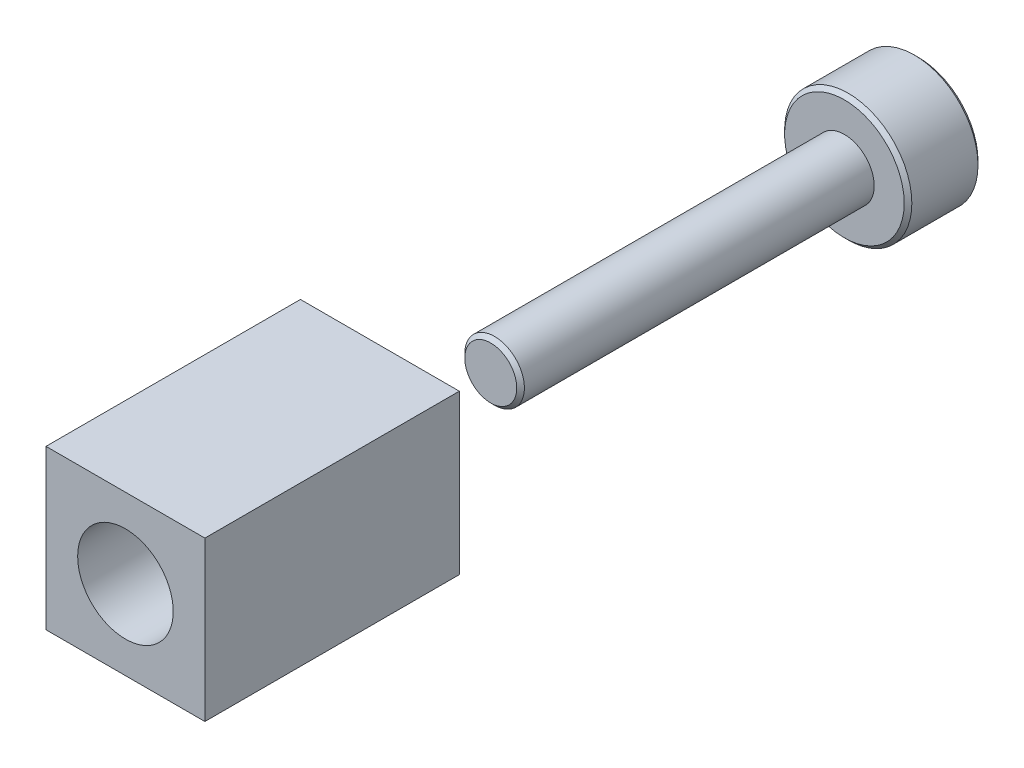
ISO-10303-21;
HEADER;
FILE_DESCRIPTION(('STEP AP214'),'2;1');
FILE_NAME('part.step','',(''),(''),'','','');
FILE_SCHEMA(('AUTOMOTIVE_DESIGN { 1 0 10303 214 1 1 1 1 }'));
ENDSEC;
DATA;
#1=APPLICATION_CONTEXT('core data for automotive mechanical design processes');
#2=APPLICATION_PROTOCOL_DEFINITION('international standard','automotive_design',2000,#1);
#3=PRODUCT_CONTEXT('',#1,'mechanical');
#4=PRODUCT('Part','Part','',(#3));
#5=PRODUCT_RELATED_PRODUCT_CATEGORY('part','',(#4));
#6=PRODUCT_DEFINITION_FORMATION('','',#4);
#7=PRODUCT_DEFINITION_CONTEXT('part definition',#1,'design');
#8=PRODUCT_DEFINITION('design','',#6,#7);
#9=PRODUCT_DEFINITION_SHAPE('','',#8);
#10=(LENGTH_UNIT() NAMED_UNIT(*) SI_UNIT(.MILLI.,.METRE.));
#11=(NAMED_UNIT(*) PLANE_ANGLE_UNIT() SI_UNIT($,.RADIAN.));
#12=(NAMED_UNIT(*) SI_UNIT($,.STERADIAN.) SOLID_ANGLE_UNIT());
#13=UNCERTAINTY_MEASURE_WITH_UNIT(LENGTH_MEASURE(1.E-05),#10,'distance_accuracy_value','');
#14=(GEOMETRIC_REPRESENTATION_CONTEXT(3) GLOBAL_UNCERTAINTY_ASSIGNED_CONTEXT((#13)) GLOBAL_UNIT_ASSIGNED_CONTEXT((#10,
#11,#12)) REPRESENTATION_CONTEXT('',''));
#15=CARTESIAN_POINT('',(0.,0.,0.));
#16=DIRECTION('',(0.,0.,1.));
#17=DIRECTION('',(1.,0.,0.));
#18=AXIS2_PLACEMENT_3D('',#15,#16,#17);
#19=CARTESIAN_POINT('',(-15.8613491960392,15.8613491960392,158.283276511442));
#20=DIRECTION('',(1.,0.,0.));
#21=DIRECTION('',(0.,1.,0.));
#22=AXIS2_PLACEMENT_3D('',#19,#20,#21);
#23=PLANE('',#22);
#24=DIRECTION('',(0.,-1.,0.));
#25=VECTOR('',#24,1.);
#26=CARTESIAN_POINT('',(-15.8613491960392,15.8613491960392,107.483276511442));
#27=LINE('',#26,#25);
#28=CARTESIAN_POINT('',(-15.8613491960392,15.8613491960392,107.483276511442));
#29=VERTEX_POINT('',#28);
#30=CARTESIAN_POINT('',(-15.8613491960392,-15.8613491960392,107.483276511442));
#31=VERTEX_POINT('',#30);
#32=EDGE_CURVE('E107',#29,#31,#27,.T.);
#33=ORIENTED_EDGE('',*,*,#32,.T.);
#34=DIRECTION('',(0.,0.,-1.));
#35=VECTOR('',#34,1.);
#36=CARTESIAN_POINT('',(-15.8613491960392,-15.8613491960392,158.283276511442));
#37=LINE('',#36,#35);
#38=CARTESIAN_POINT('',(-15.8613491960392,-15.8613491960392,158.283276511442));
#39=VERTEX_POINT('',#38);
#40=EDGE_CURVE('E12',#39,#31,#37,.T.);
#41=ORIENTED_EDGE('',*,*,#40,.F.);
#42=DIRECTION('',(0.,-1.,0.));
#43=VECTOR('',#42,1.);
#44=CARTESIAN_POINT('',(-15.8613491960392,15.8613491960392,158.283276511442));
#45=LINE('',#44,#43);
#46=CARTESIAN_POINT('',(-15.8613491960392,15.8613491960392,158.283276511442));
#47=VERTEX_POINT('',#46);
#48=EDGE_CURVE('E95',#47,#39,#45,.T.);
#49=ORIENTED_EDGE('',*,*,#48,.F.);
#50=DIRECTION('',(0.,0.,-1.));
#51=VECTOR('',#50,1.);
#52=CARTESIAN_POINT('',(-15.8613491960392,15.8613491960392,158.283276511442));
#53=LINE('',#52,#51);
#54=EDGE_CURVE('E103',#47,#29,#53,.T.);
#55=ORIENTED_EDGE('',*,*,#54,.T.);
#56=EDGE_LOOP('',(#33,#41,#49,#55));
#57=FACE_BOUND('',#56,.T.);
#58=ADVANCED_FACE('F44',(#57),#23,.F.);
#59=CARTESIAN_POINT('',(-15.8613491960392,-15.8613491960392,158.283276511442));
#60=DIRECTION('',(0.,1.,0.));
#61=DIRECTION('',(0.,0.,1.));
#62=AXIS2_PLACEMENT_3D('',#59,#60,#61);
#63=PLANE('',#62);
#64=DIRECTION('',(1.,0.,0.));
#65=VECTOR('',#64,1.);
#66=CARTESIAN_POINT('',(-15.8613491960392,-15.8613491960392,107.483276511442));
#67=LINE('',#66,#65);
#68=CARTESIAN_POINT('',(15.8613491960392,-15.8613491960392,107.483276511442));
#69=VERTEX_POINT('',#68);
#70=EDGE_CURVE('E99',#31,#69,#67,.T.);
#71=ORIENTED_EDGE('',*,*,#70,.T.);
#72=DIRECTION('',(0.,0.,-1.));
#73=VECTOR('',#72,1.);
#74=CARTESIAN_POINT('',(15.8613491960392,-15.8613491960392,158.283276511442));
#75=LINE('',#74,#73);
#76=CARTESIAN_POINT('',(15.8613491960392,-15.8613491960392,158.283276511442));
#77=VERTEX_POINT('',#76);
#78=EDGE_CURVE('E52',#77,#69,#75,.T.);
#79=ORIENTED_EDGE('',*,*,#78,.F.);
#80=DIRECTION('',(1.,0.,0.));
#81=VECTOR('',#80,1.);
#82=CARTESIAN_POINT('',(-15.8613491960392,-15.8613491960392,158.283276511442));
#83=LINE('',#82,#81);
#84=EDGE_CURVE('E90',#39,#77,#83,.T.);
#85=ORIENTED_EDGE('',*,*,#84,.F.);
#86=ORIENTED_EDGE('',*,*,#40,.T.);
#87=EDGE_LOOP('',(#71,#79,#85,#86));
#88=FACE_BOUND('',#87,.T.);
#89=ADVANCED_FACE('F98',(#88),#63,.F.);
#90=CARTESIAN_POINT('',(15.8613491960392,15.8613491960392,158.283276511442));
#91=DIRECTION('',(-1.,0.,0.));
#92=DIRECTION('',(0.,-1.,0.));
#93=AXIS2_PLACEMENT_3D('',#90,#91,#92);
#94=PLANE('',#93);
#95=DIRECTION('',(0.,1.,0.));
#96=VECTOR('',#95,1.);
#97=CARTESIAN_POINT('',(15.8613491960392,15.8613491960392,107.483276511442));
#98=LINE('',#97,#96);
#99=CARTESIAN_POINT('',(15.8613491960392,15.8613491960392,107.483276511442));
#100=VERTEX_POINT('',#99);
#101=EDGE_CURVE('E77',#69,#100,#98,.T.);
#102=ORIENTED_EDGE('',*,*,#101,.T.);
#103=DIRECTION('',(0.,0.,-1.));
#104=VECTOR('',#103,1.);
#105=CARTESIAN_POINT('',(15.8613491960392,15.8613491960392,158.283276511442));
#106=LINE('',#105,#104);
#107=CARTESIAN_POINT('',(15.8613491960392,15.8613491960392,158.283276511442));
#108=VERTEX_POINT('',#107);
#109=EDGE_CURVE('E100',#108,#100,#106,.T.);
#110=ORIENTED_EDGE('',*,*,#109,.F.);
#111=DIRECTION('',(0.,1.,0.));
#112=VECTOR('',#111,1.);
#113=CARTESIAN_POINT('',(15.8613491960392,15.8613491960392,158.283276511442));
#114=LINE('',#113,#112);
#115=EDGE_CURVE('E93',#77,#108,#114,.T.);
#116=ORIENTED_EDGE('',*,*,#115,.F.);
#117=ORIENTED_EDGE('',*,*,#78,.T.);
#118=EDGE_LOOP('',(#102,#110,#116,#117));
#119=FACE_BOUND('',#118,.T.);
#120=ADVANCED_FACE('F101',(#119),#94,.F.);
#121=CARTESIAN_POINT('',(-15.8613491960392,15.8613491960392,158.283276511442));
#122=DIRECTION('',(0.,-1.,0.));
#123=DIRECTION('',(0.,0.,-1.));
#124=AXIS2_PLACEMENT_3D('',#121,#122,#123);
#125=PLANE('',#124);
#126=DIRECTION('',(-1.,0.,0.));
#127=VECTOR('',#126,1.);
#128=CARTESIAN_POINT('',(-15.8613491960392,15.8613491960392,107.483276511442));
#129=LINE('',#128,#127);
#130=EDGE_CURVE('E83',#100,#29,#129,.T.);
#131=ORIENTED_EDGE('',*,*,#130,.T.);
#132=ORIENTED_EDGE('',*,*,#54,.F.);
#133=DIRECTION('',(-1.,0.,0.));
#134=VECTOR('',#133,1.);
#135=CARTESIAN_POINT('',(-15.8613491960392,15.8613491960392,158.283276511442));
#136=LINE('',#135,#134);
#137=EDGE_CURVE('E60',#108,#47,#136,.T.);
#138=ORIENTED_EDGE('',*,*,#137,.F.);
#139=ORIENTED_EDGE('',*,*,#109,.T.);
#140=EDGE_LOOP('',(#131,#132,#138,#139));
#141=FACE_BOUND('',#140,.T.);
#142=ADVANCED_FACE('F115',(#141),#125,.F.);
#143=CARTESIAN_POINT('',(0.,0.,158.283276511442));
#144=DIRECTION('',(0.,0.,1.));
#145=DIRECTION('',(1.,0.,0.));
#146=AXIS2_PLACEMENT_3D('',#143,#144,#145);
#147=PLANE('',#146);
#148=CARTESIAN_POINT('',(0.,0.,158.283276511442));
#149=DIRECTION('',(0.,0.,-1.));
#150=DIRECTION('',(-1.,0.,0.));
#151=AXIS2_PLACEMENT_3D('',#148,#149,#150);
#152=CIRCLE('',#151,9.54173223558893);
#153=CARTESIAN_POINT('',(-9.54173223558893,0.,158.283276511442));
#154=VERTEX_POINT('',#153);
#155=EDGE_CURVE('E110',#154,#154,#152,.T.);
#156=ORIENTED_EDGE('',*,*,#155,.T.);
#157=EDGE_LOOP('',(#156));
#158=FACE_BOUND('',#157,.T.);
#159=ORIENTED_EDGE('',*,*,#48,.T.);
#160=ORIENTED_EDGE('',*,*,#84,.T.);
#161=ORIENTED_EDGE('',*,*,#115,.T.);
#162=ORIENTED_EDGE('',*,*,#137,.T.);
#163=EDGE_LOOP('',(#159,#160,#161,#162));
#164=FACE_BOUND('',#163,.T.);
#165=ADVANCED_FACE('F91',(#158,#164),#147,.T.);
#166=CARTESIAN_POINT('',(0.,0.,107.483276511442));
#167=DIRECTION('',(0.,0.,1.));
#168=DIRECTION('',(1.,0.,0.));
#169=AXIS2_PLACEMENT_3D('',#166,#167,#168);
#170=PLANE('',#169);
#171=CARTESIAN_POINT('',(0.,0.,107.483276511442));
#172=DIRECTION('',(0.,0.,-1.));
#173=DIRECTION('',(-1.,0.,0.));
#174=AXIS2_PLACEMENT_3D('',#171,#172,#173);
#175=CIRCLE('',#174,9.54173223558893);
#176=CARTESIAN_POINT('',(-9.54173223558893,0.,107.483276511442));
#177=VERTEX_POINT('',#176);
#178=EDGE_CURVE('E121',#177,#177,#175,.T.);
#179=ORIENTED_EDGE('',*,*,#178,.F.);
#180=EDGE_LOOP('',(#179));
#181=FACE_BOUND('',#180,.T.);
#182=ORIENTED_EDGE('',*,*,#32,.F.);
#183=ORIENTED_EDGE('',*,*,#130,.F.);
#184=ORIENTED_EDGE('',*,*,#101,.F.);
#185=ORIENTED_EDGE('',*,*,#70,.F.);
#186=EDGE_LOOP('',(#182,#183,#184,#185));
#187=FACE_BOUND('',#186,.T.);
#188=ADVANCED_FACE('F118',(#181,#187),#170,.F.);
#189=CARTESIAN_POINT('',(0.,0.,158.283276511442));
#190=DIRECTION('',(0.,0.,-1.));
#191=DIRECTION('',(-1.,0.,0.));
#192=AXIS2_PLACEMENT_3D('',#189,#190,#191);
#193=CYLINDRICAL_SURFACE('',#192,9.54173223558893);
#194=ORIENTED_EDGE('',*,*,#155,.F.);
#195=EDGE_LOOP('',(#194));
#196=FACE_BOUND('',#195,.T.);
#197=ORIENTED_EDGE('',*,*,#178,.T.);
#198=EDGE_LOOP('',(#197));
#199=FACE_BOUND('',#198,.T.);
#200=ADVANCED_FACE('F128',(#196,#199),#193,.F.);
#201=CLOSED_SHELL('',(#58,#89,#120,#142,#165,#188,#200));
#202=MANIFOLD_SOLID_BREP('B2',#201);
#203=CARTESIAN_POINT('',(0.,0.,14.732));
#204=DIRECTION('',(0.,0.,1.));
#205=DIRECTION('',(1.,0.,0.));
#206=AXIS2_PLACEMENT_3D('',#203,#204,#205);
#207=PLANE('',#206);
#208=CARTESIAN_POINT('',(0.,0.,14.732));
#209=DIRECTION('',(0.,0.,1.));
#210=DIRECTION('',(1.,0.,0.));
#211=AXIS2_PLACEMENT_3D('',#208,#209,#210);
#212=CIRCLE('',#211,11.938);
#213=CARTESIAN_POINT('',(11.938,0.,14.732));
#214=VERTEX_POINT('',#213);
#215=EDGE_CURVE('E199',#214,#214,#212,.T.);
#216=ORIENTED_EDGE('',*,*,#215,.T.);
#217=EDGE_LOOP('',(#216));
#218=FACE_BOUND('',#217,.T.);
#219=CARTESIAN_POINT('',(0.,0.,14.732));
#220=DIRECTION('',(0.,0.,1.));
#221=DIRECTION('',(1.,0.,0.));
#222=AXIS2_PLACEMENT_3D('',#219,#220,#221);
#223=CIRCLE('',#222,5.95369618770292);
#224=CARTESIAN_POINT('',(5.95369618770292,0.,14.732));
#225=VERTEX_POINT('',#224);
#226=EDGE_CURVE('E214',#225,#225,#223,.T.);
#227=ORIENTED_EDGE('',*,*,#226,.F.);
#228=EDGE_LOOP('',(#227));
#229=FACE_BOUND('',#228,.T.);
#230=ADVANCED_FACE('F188',(#218,#229),#207,.T.);
#231=CARTESIAN_POINT('',(0.,0.,14.732));
#232=DIRECTION('',(0.,0.,-1.));
#233=DIRECTION('',(-1.,0.,0.));
#234=AXIS2_PLACEMENT_3D('',#231,#232,#233);
#235=CYLINDRICAL_SURFACE('',#234,12.7);
#236=CARTESIAN_POINT('',(0.,0.,0.762000000000006));
#237=DIRECTION('',(0.,0.,1.));
#238=DIRECTION('',(1.,0.,0.));
#239=AXIS2_PLACEMENT_3D('',#236,#237,#238);
#240=CIRCLE('',#239,12.7);
#241=CARTESIAN_POINT('',(12.7,0.,0.762000000000006));
#242=VERTEX_POINT('',#241);
#243=EDGE_CURVE('E208',#242,#242,#240,.T.);
#244=ORIENTED_EDGE('',*,*,#243,.T.);
#245=EDGE_LOOP('',(#244));
#246=FACE_BOUND('',#245,.T.);
#247=CARTESIAN_POINT('',(0.,0.,13.97));
#248=DIRECTION('',(0.,0.,1.));
#249=DIRECTION('',(1.,0.,0.));
#250=AXIS2_PLACEMENT_3D('',#247,#248,#249);
#251=CIRCLE('',#250,12.7);
#252=CARTESIAN_POINT('',(12.7,0.,13.97));
#253=VERTEX_POINT('',#252);
#254=EDGE_CURVE('E211',#253,#253,#251,.F.);
#255=ORIENTED_EDGE('',*,*,#254,.T.);
#256=EDGE_LOOP('',(#255));
#257=FACE_BOUND('',#256,.T.);
#258=ADVANCED_FACE('F221',(#246,#257),#235,.T.);
#259=CARTESIAN_POINT('',(0.,0.,0.));
#260=DIRECTION('',(0.,0.,1.));
#261=DIRECTION('',(1.,0.,0.));
#262=AXIS2_PLACEMENT_3D('',#259,#260,#261);
#263=PLANE('',#262);
#264=CARTESIAN_POINT('',(0.,0.,0.));
#265=DIRECTION('',(0.,0.,1.));
#266=DIRECTION('',(1.,0.,0.));
#267=AXIS2_PLACEMENT_3D('',#264,#265,#266);
#268=CIRCLE('',#267,11.938);
#269=CARTESIAN_POINT('',(11.938,0.,0.));
#270=VERTEX_POINT('',#269);
#271=EDGE_CURVE('E203',#270,#270,#268,.F.);
#272=ORIENTED_EDGE('',*,*,#271,.T.);
#273=EDGE_LOOP('',(#272));
#274=FACE_BOUND('',#273,.T.);
#275=ADVANCED_FACE('F227',(#274),#263,.F.);
#276=CARTESIAN_POINT('',(0.,0.,85.344));
#277=DIRECTION('',(0.,0.,-1.));
#278=DIRECTION('',(-1.,0.,0.));
#279=AXIS2_PLACEMENT_3D('',#276,#277,#278);
#280=CYLINDRICAL_SURFACE('',#279,5.95369618770292);
#281=CARTESIAN_POINT('',(0.,0.,84.582));
#282=DIRECTION('',(0.,0.,1.));
#283=DIRECTION('',(1.,0.,0.));
#284=AXIS2_PLACEMENT_3D('',#281,#282,#283);
#285=CIRCLE('',#284,5.95369618770292);
#286=CARTESIAN_POINT('',(-5.95369618770292,0.,84.582));
#287=VERTEX_POINT('',#286);
#288=EDGE_CURVE('E43',#287,#287,#285,.F.);
#289=ORIENTED_EDGE('',*,*,#288,.T.);
#290=EDGE_LOOP('',(#289));
#291=FACE_BOUND('',#290,.T.);
#292=ORIENTED_EDGE('',*,*,#226,.T.);
#293=EDGE_LOOP('',(#292));
#294=FACE_BOUND('',#293,.T.);
#295=ADVANCED_FACE('F218',(#291,#294),#280,.T.);
#296=CARTESIAN_POINT('',(0.,0.,85.344));
#297=DIRECTION('',(0.,0.,1.));
#298=DIRECTION('',(1.,0.,0.));
#299=AXIS2_PLACEMENT_3D('',#296,#297,#298);
#300=PLANE('',#299);
#301=CARTESIAN_POINT('',(0.,0.,85.344));
#302=DIRECTION('',(0.,0.,1.));
#303=DIRECTION('',(1.,0.,0.));
#304=AXIS2_PLACEMENT_3D('',#301,#302,#303);
#305=CIRCLE('',#304,5.1916961877029);
#306=CARTESIAN_POINT('',(-5.19169618770291,0.,85.344));
#307=VERTEX_POINT('',#306);
#308=EDGE_CURVE('E195',#307,#307,#305,.T.);
#309=ORIENTED_EDGE('',*,*,#308,.T.);
#310=EDGE_LOOP('',(#309));
#311=FACE_BOUND('',#310,.T.);
#312=ADVANCED_FACE('F239',(#311),#300,.T.);
#313=CARTESIAN_POINT('',(0.,0.,0.762000000000006));
#314=DIRECTION('',(0.,0.,1.));
#315=DIRECTION('',(1.,0.,0.));
#316=AXIS2_PLACEMENT_3D('',#313,#314,#315);
#317=CONICAL_SURFACE('',#316,12.7,0.78539816339745);
#318=ORIENTED_EDGE('',*,*,#271,.F.);
#319=EDGE_LOOP('',(#318));
#320=FACE_BOUND('',#319,.T.);
#321=ORIENTED_EDGE('',*,*,#243,.F.);
#322=EDGE_LOOP('',(#321));
#323=FACE_BOUND('',#322,.T.);
#324=ADVANCED_FACE('F236',(#320,#323),#317,.T.);
#325=CARTESIAN_POINT('',(0.,0.,14.732));
#326=DIRECTION('',(0.,0.,-1.));
#327=DIRECTION('',(-1.,0.,0.));
#328=AXIS2_PLACEMENT_3D('',#325,#326,#327);
#329=CONICAL_SURFACE('',#328,11.938,0.785398163397447);
#330=ORIENTED_EDGE('',*,*,#254,.F.);
#331=EDGE_LOOP('',(#330));
#332=FACE_BOUND('',#331,.T.);
#333=ORIENTED_EDGE('',*,*,#215,.F.);
#334=EDGE_LOOP('',(#333));
#335=FACE_BOUND('',#334,.T.);
#336=ADVANCED_FACE('F238',(#332,#335),#329,.T.);
#337=CARTESIAN_POINT('',(0.,0.,85.344));
#338=DIRECTION('',(0.,0.,-1.));
#339=DIRECTION('',(-1.,0.,0.));
#340=AXIS2_PLACEMENT_3D('',#337,#338,#339);
#341=CONICAL_SURFACE('',#340,5.1916961877029,0.785398163397448);
#342=CARTESIAN_POINT('',(-5.95369618770292,0.,84.582));
#343=CARTESIAN_POINT('',(-5.94575868770293,0.,84.5899375));
#344=CARTESIAN_POINT('',(-5.93782118770293,0.,84.597875));
#345=CARTESIAN_POINT('',(-5.92194618770292,0.,84.61375));
#346=CARTESIAN_POINT('',(-5.91400868770292,0.,84.6216875));
#347=CARTESIAN_POINT('',(-5.89813368770292,0.,84.6375625));
#348=CARTESIAN_POINT('',(-5.89019618770292,0.,84.6455));
#349=CARTESIAN_POINT('',(-5.87432118770292,0.,84.661375));
#350=CARTESIAN_POINT('',(-5.86638368770292,0.,84.6693125));
#351=CARTESIAN_POINT('',(-5.85050868770292,0.,84.6851875));
#352=CARTESIAN_POINT('',(-5.84257118770292,0.,84.693125));
#353=CARTESIAN_POINT('',(-5.82669618770292,0.,84.709));
#354=CARTESIAN_POINT('',(-5.81875868770292,0.,84.7169375));
#355=CARTESIAN_POINT('',(-5.80288368770292,0.,84.7328125));
#356=CARTESIAN_POINT('',(-5.79494618770292,0.,84.74075));
#357=CARTESIAN_POINT('',(-5.77907118770292,0.,84.756625));
#358=CARTESIAN_POINT('',(-5.77113368770292,0.,84.7645625));
#359=CARTESIAN_POINT('',(-5.75525868770292,0.,84.7804375));
#360=CARTESIAN_POINT('',(-5.74732118770292,0.,84.788375));
#361=CARTESIAN_POINT('',(-5.73144618770292,0.,84.80425));
#362=CARTESIAN_POINT('',(-5.72350868770292,0.,84.8121875));
#363=CARTESIAN_POINT('',(-5.70763368770292,0.,84.8280625));
#364=CARTESIAN_POINT('',(-5.69969618770292,0.,84.836));
#365=CARTESIAN_POINT('',(-5.68382118770292,0.,84.851875));
#366=CARTESIAN_POINT('',(-5.67588368770292,0.,84.8598125));
#367=CARTESIAN_POINT('',(-5.66000868770292,0.,84.8756875));
#368=CARTESIAN_POINT('',(-5.65207118770292,0.,84.883625));
#369=CARTESIAN_POINT('',(-5.63619618770292,0.,84.8995));
#370=CARTESIAN_POINT('',(-5.62825868770292,0.,84.9074375));
#371=CARTESIAN_POINT('',(-5.61238368770292,0.,84.9233125));
#372=CARTESIAN_POINT('',(-5.60444618770292,0.,84.93125));
#373=CARTESIAN_POINT('',(-5.58857118770292,0.,84.947125));
#374=CARTESIAN_POINT('',(-5.58063368770292,0.,84.9550625));
#375=CARTESIAN_POINT('',(-5.56475868770292,0.,84.9709375));
#376=CARTESIAN_POINT('',(-5.55682118770292,0.,84.978875));
#377=CARTESIAN_POINT('',(-5.54094618770292,0.,84.99475));
#378=CARTESIAN_POINT('',(-5.53300868770292,0.,85.0026875));
#379=CARTESIAN_POINT('',(-5.51713368770292,0.,85.0185625));
#380=CARTESIAN_POINT('',(-5.50919618770292,0.,85.0265));
#381=CARTESIAN_POINT('',(-5.49332118770292,0.,85.042375));
#382=CARTESIAN_POINT('',(-5.48538368770292,0.,85.0503125));
#383=CARTESIAN_POINT('',(-5.46950868770292,0.,85.0661875));
#384=CARTESIAN_POINT('',(-5.46157118770291,0.,85.074125));
#385=CARTESIAN_POINT('',(-5.44569618770291,0.,85.09));
#386=CARTESIAN_POINT('',(-5.43775868770292,0.,85.0979375));
#387=CARTESIAN_POINT('',(-5.42188368770292,0.,85.1138125));
#388=CARTESIAN_POINT('',(-5.41394618770291,0.,85.12175));
#389=CARTESIAN_POINT('',(-5.39807118770291,0.,85.137625));
#390=CARTESIAN_POINT('',(-5.39013368770291,0.,85.1455625));
#391=CARTESIAN_POINT('',(-5.37425868770291,0.,85.1614375));
#392=CARTESIAN_POINT('',(-5.36632118770291,0.,85.169375));
#393=CARTESIAN_POINT('',(-5.35044618770291,0.,85.18525));
#394=CARTESIAN_POINT('',(-5.34250868770291,0.,85.1931875));
#395=CARTESIAN_POINT('',(-5.32663368770291,0.,85.2090625));
#396=CARTESIAN_POINT('',(-5.31869618770291,0.,85.217));
#397=CARTESIAN_POINT('',(-5.30282118770292,0.,85.232875));
#398=CARTESIAN_POINT('',(-5.29488368770291,0.,85.2408125));
#399=CARTESIAN_POINT('',(-5.27900868770291,0.,85.2566875));
#400=CARTESIAN_POINT('',(-5.27107118770291,0.,85.264625));
#401=CARTESIAN_POINT('',(-5.25519618770291,0.,85.2805));
#402=CARTESIAN_POINT('',(-5.24725868770291,0.,85.2884375));
#403=CARTESIAN_POINT('',(-5.23138368770291,0.,85.3043125));
#404=CARTESIAN_POINT('',(-5.22344618770291,0.,85.31225));
#405=CARTESIAN_POINT('',(-5.20757118770291,0.,85.328125));
#406=CARTESIAN_POINT('',(-5.19963368770291,0.,85.3360625));
#407=CARTESIAN_POINT('',(-5.19169618770291,0.,85.344));
#408=B_SPLINE_CURVE_WITH_KNOTS('',3,(#342,#343,#344,#345,#346,#347,#348,#349,#350,#351,#352,
#353,#354,#355,#356,#357,#358,#359,#360,#361,#362,#363,#364,#365,#366,#367,#368,#369,#370,#371,
#372,#373,#374,#375,#376,#377,#378,#379,#380,#381,#382,#383,#384,#385,#386,#387,#388,#389,#390,
#391,#392,#393,#394,#395,#396,#397,#398,#399,#400,#401,#402,#403,#404,#405,#406,#407),
.UNSPECIFIED.,.F.,.F.,(4,2,2,2,2,2,2,2,2,2,2,2,2,2,2,2,2,2,2,2,2,2,2,2,2,2,2,2,2,2,2,2,4),(0.,
0.0336759604540179,0.0673519209080259,0.101027881362034,0.134703841816042,0.16837980227005,
0.202055762724068,0.235731723178076,0.269407683632084,0.303083644086092,0.3367596045401,
0.370435564994118,0.404111525448126,0.437787485902134,0.471463446356142,0.50513940681015,
0.538815367264158,0.572491327718176,0.606167288172184,0.639843248626192,0.6735192090802,
0.707195169534208,0.740871129988226,0.774547090442234,0.808223050896242,0.84189901135025,
0.875574971804258,0.909250932258276,0.942926892712284,0.976602853166292,1.0102788136203,
1.04395477407431,1.07763073452833),.UNSPECIFIED.);
#409=EDGE_CURVE('BSEAM190',#287,#307,#408,.T.);
#410=ORIENTED_EDGE('',*,*,#288,.F.);
#411=ORIENTED_EDGE('',*,*,#308,.F.);
#412=ORIENTED_EDGE('',*,*,#409,.T.);
#413=ORIENTED_EDGE('',*,*,#409,.F.);
#414=EDGE_LOOP('',(#410,#412,#411,#413));
#415=FACE_BOUND('',#414,.T.);
#416=ADVANCED_FACE('F190',(#415),#341,.T.);
#417=CLOSED_SHELL('',(#230,#258,#275,#295,#312,#324,#336,#416));
#418=MANIFOLD_SOLID_BREP('B6',#417);
#419=ADVANCED_BREP_SHAPE_REPRESENTATION('',(#18,#202,#418),#14);
#420=SHAPE_DEFINITION_REPRESENTATION(#9,#419);
ENDSEC;
END-ISO-10303-21;
